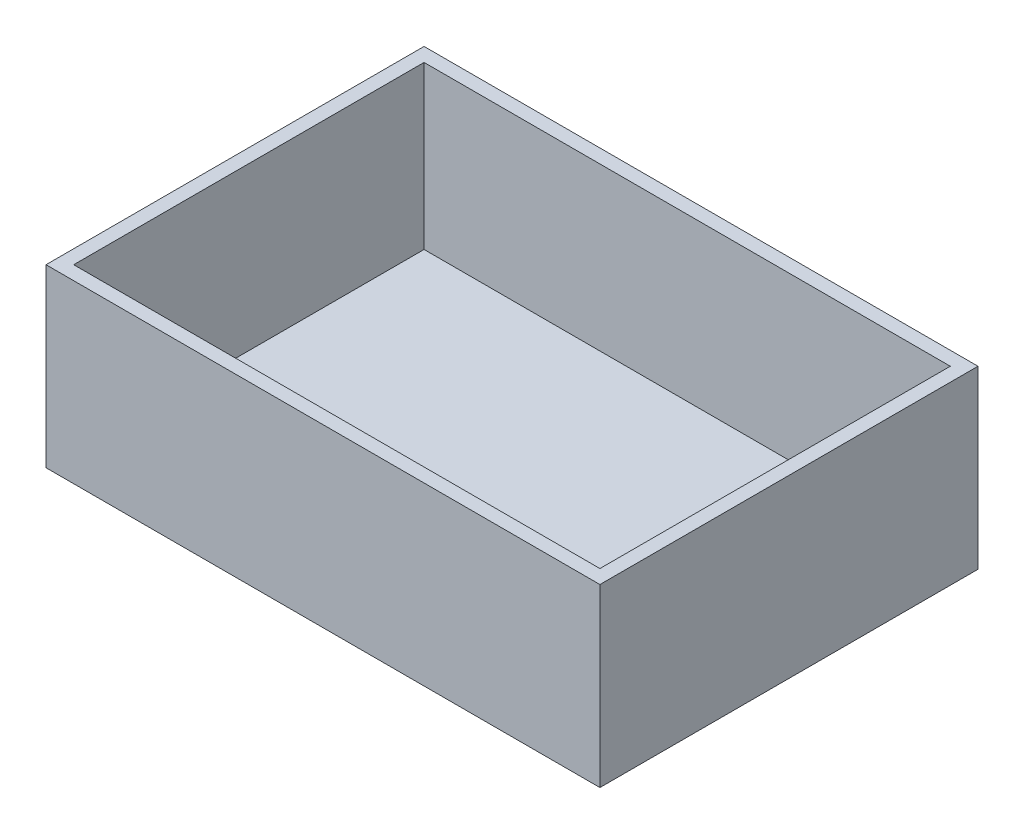
ISO-10303-21;
HEADER;
FILE_DESCRIPTION(('STEP AP214'),'2;1');
FILE_NAME('part.step','',(''),(''),'','','');
FILE_SCHEMA(('AUTOMOTIVE_DESIGN { 1 0 10303 214 1 1 1 1 }'));
ENDSEC;
DATA;
#1=APPLICATION_CONTEXT('core data for automotive mechanical design processes');
#2=APPLICATION_PROTOCOL_DEFINITION('international standard','automotive_design',2000,#1);
#3=PRODUCT_CONTEXT('',#1,'mechanical');
#4=PRODUCT('Part','Part','',(#3));
#5=PRODUCT_RELATED_PRODUCT_CATEGORY('part','',(#4));
#6=PRODUCT_DEFINITION_FORMATION('','',#4);
#7=PRODUCT_DEFINITION_CONTEXT('part definition',#1,'design');
#8=PRODUCT_DEFINITION('design','',#6,#7);
#9=PRODUCT_DEFINITION_SHAPE('','',#8);
#10=(LENGTH_UNIT() NAMED_UNIT(*) SI_UNIT(.MILLI.,.METRE.));
#11=(NAMED_UNIT(*) PLANE_ANGLE_UNIT() SI_UNIT($,.RADIAN.));
#12=(NAMED_UNIT(*) SI_UNIT($,.STERADIAN.) SOLID_ANGLE_UNIT());
#13=UNCERTAINTY_MEASURE_WITH_UNIT(LENGTH_MEASURE(1.E-05),#10,'distance_accuracy_value','');
#14=(GEOMETRIC_REPRESENTATION_CONTEXT(3) GLOBAL_UNCERTAINTY_ASSIGNED_CONTEXT((#13)) GLOBAL_UNIT_ASSIGNED_CONTEXT((#10,
#11,#12)) REPRESENTATION_CONTEXT('',''));
#15=CARTESIAN_POINT('',(0.,0.,0.));
#16=DIRECTION('',(0.,0.,1.));
#17=DIRECTION('',(1.,0.,0.));
#18=AXIS2_PLACEMENT_3D('',#15,#16,#17);
#19=CARTESIAN_POINT('',(0.,16.,0.));
#20=DIRECTION('',(1.,0.,0.));
#21=DIRECTION('',(0.,0.,-1.));
#22=AXIS2_PLACEMENT_3D('',#19,#20,#21);
#23=PLANE('',#22);
#24=DIRECTION('',(0.,0.,1.));
#25=VECTOR('',#24,1.);
#26=CARTESIAN_POINT('',(0.,0.,0.));
#27=LINE('',#26,#25);
#28=CARTESIAN_POINT('',(0.,0.,0.));
#29=VERTEX_POINT('',#28);
#30=CARTESIAN_POINT('',(0.,0.,34.4));
#31=VERTEX_POINT('',#30);
#32=EDGE_CURVE('E147',#29,#31,#27,.T.);
#33=ORIENTED_EDGE('',*,*,#32,.T.);
#34=DIRECTION('',(0.,-1.,0.));
#35=VECTOR('',#34,1.);
#36=CARTESIAN_POINT('',(0.,16.,34.4));
#37=LINE('',#36,#35);
#38=CARTESIAN_POINT('',(0.,16.,34.4));
#39=VERTEX_POINT('',#38);
#40=EDGE_CURVE('E11',#39,#31,#37,.T.);
#41=ORIENTED_EDGE('',*,*,#40,.F.);
#42=DIRECTION('',(0.,0.,1.));
#43=VECTOR('',#42,1.);
#44=CARTESIAN_POINT('',(0.,16.,0.));
#45=LINE('',#44,#43);
#46=CARTESIAN_POINT('',(0.,16.,0.));
#47=VERTEX_POINT('',#46);
#48=EDGE_CURVE('E140',#47,#39,#45,.T.);
#49=ORIENTED_EDGE('',*,*,#48,.F.);
#50=DIRECTION('',(0.,-1.,0.));
#51=VECTOR('',#50,1.);
#52=CARTESIAN_POINT('',(0.,16.,0.));
#53=LINE('',#52,#51);
#54=EDGE_CURVE('E146',#47,#29,#53,.T.);
#55=ORIENTED_EDGE('',*,*,#54,.T.);
#56=EDGE_LOOP('',(#33,#41,#49,#55));
#57=FACE_BOUND('',#56,.T.);
#58=ADVANCED_FACE('F33',(#57),#23,.F.);
#59=CARTESIAN_POINT('',(0.,16.,34.4));
#60=DIRECTION('',(0.,0.,-1.));
#61=DIRECTION('',(-1.,0.,0.));
#62=AXIS2_PLACEMENT_3D('',#59,#60,#61);
#63=PLANE('',#62);
#64=DIRECTION('',(1.,0.,0.));
#65=VECTOR('',#64,1.);
#66=CARTESIAN_POINT('',(0.,0.,34.4));
#67=LINE('',#66,#65);
#68=CARTESIAN_POINT('',(50.4,0.,34.4));
#69=VERTEX_POINT('',#68);
#70=EDGE_CURVE('E150',#31,#69,#67,.T.);
#71=ORIENTED_EDGE('',*,*,#70,.T.);
#72=DIRECTION('',(0.,-1.,0.));
#73=VECTOR('',#72,1.);
#74=CARTESIAN_POINT('',(50.4,16.,34.4));
#75=LINE('',#74,#73);
#76=CARTESIAN_POINT('',(50.4,16.,34.4));
#77=VERTEX_POINT('',#76);
#78=EDGE_CURVE('E40',#77,#69,#75,.T.);
#79=ORIENTED_EDGE('',*,*,#78,.F.);
#80=DIRECTION('',(1.,0.,0.));
#81=VECTOR('',#80,1.);
#82=CARTESIAN_POINT('',(0.,16.,34.4));
#83=LINE('',#82,#81);
#84=EDGE_CURVE('E84',#39,#77,#83,.T.);
#85=ORIENTED_EDGE('',*,*,#84,.F.);
#86=ORIENTED_EDGE('',*,*,#40,.T.);
#87=EDGE_LOOP('',(#71,#79,#85,#86));
#88=FACE_BOUND('',#87,.T.);
#89=ADVANCED_FACE('F179',(#88),#63,.F.);
#90=CARTESIAN_POINT('',(50.4,16.,0.));
#91=DIRECTION('',(-1.,0.,0.));
#92=DIRECTION('',(0.,0.,1.));
#93=AXIS2_PLACEMENT_3D('',#90,#91,#92);
#94=PLANE('',#93);
#95=DIRECTION('',(0.,0.,-1.));
#96=VECTOR('',#95,1.);
#97=CARTESIAN_POINT('',(50.4,0.,0.));
#98=LINE('',#97,#96);
#99=CARTESIAN_POINT('',(50.4,0.,0.));
#100=VERTEX_POINT('',#99);
#101=EDGE_CURVE('E152',#69,#100,#98,.T.);
#102=ORIENTED_EDGE('',*,*,#101,.T.);
#103=DIRECTION('',(0.,-1.,0.));
#104=VECTOR('',#103,1.);
#105=CARTESIAN_POINT('',(50.4,16.,0.));
#106=LINE('',#105,#104);
#107=CARTESIAN_POINT('',(50.4,16.,0.));
#108=VERTEX_POINT('',#107);
#109=EDGE_CURVE('E156',#108,#100,#106,.T.);
#110=ORIENTED_EDGE('',*,*,#109,.F.);
#111=DIRECTION('',(0.,0.,-1.));
#112=VECTOR('',#111,1.);
#113=CARTESIAN_POINT('',(50.4,16.,0.));
#114=LINE('',#113,#112);
#115=EDGE_CURVE('E143',#77,#108,#114,.T.);
#116=ORIENTED_EDGE('',*,*,#115,.F.);
#117=ORIENTED_EDGE('',*,*,#78,.T.);
#118=EDGE_LOOP('',(#102,#110,#116,#117));
#119=FACE_BOUND('',#118,.T.);
#120=ADVANCED_FACE('F161',(#119),#94,.F.);
#121=CARTESIAN_POINT('',(0.,16.,0.));
#122=DIRECTION('',(0.,0.,1.));
#123=DIRECTION('',(1.,0.,0.));
#124=AXIS2_PLACEMENT_3D('',#121,#122,#123);
#125=PLANE('',#124);
#126=DIRECTION('',(-1.,0.,0.));
#127=VECTOR('',#126,1.);
#128=CARTESIAN_POINT('',(0.,0.,0.));
#129=LINE('',#128,#127);
#130=EDGE_CURVE('E77',#100,#29,#129,.T.);
#131=ORIENTED_EDGE('',*,*,#130,.T.);
#132=ORIENTED_EDGE('',*,*,#54,.F.);
#133=DIRECTION('',(-1.,0.,0.));
#134=VECTOR('',#133,1.);
#135=CARTESIAN_POINT('',(0.,16.,0.));
#136=LINE('',#135,#134);
#137=EDGE_CURVE('E56',#108,#47,#136,.T.);
#138=ORIENTED_EDGE('',*,*,#137,.F.);
#139=ORIENTED_EDGE('',*,*,#109,.T.);
#140=EDGE_LOOP('',(#131,#132,#138,#139));
#141=FACE_BOUND('',#140,.T.);
#142=ADVANCED_FACE('F169',(#141),#125,.F.);
#143=CARTESIAN_POINT('',(0.,16.,0.));
#144=DIRECTION('',(0.,1.,0.));
#145=DIRECTION('',(0.,0.,1.));
#146=AXIS2_PLACEMENT_3D('',#143,#144,#145);
#147=PLANE('',#146);
#148=DIRECTION('',(0.,0.,1.));
#149=VECTOR('',#148,1.);
#150=CARTESIAN_POINT('',(1.26,16.,0.));
#151=LINE('',#150,#149);
#152=CARTESIAN_POINT('',(1.26,16.,1.26));
#153=VERTEX_POINT('',#152);
#154=CARTESIAN_POINT('',(1.26,16.,33.14));
#155=VERTEX_POINT('',#154);
#156=EDGE_CURVE('E129',#153,#155,#151,.T.);
#157=ORIENTED_EDGE('',*,*,#156,.F.);
#158=DIRECTION('',(-1.,0.,0.));
#159=VECTOR('',#158,1.);
#160=CARTESIAN_POINT('',(0.,16.,1.26));
#161=LINE('',#160,#159);
#162=CARTESIAN_POINT('',(49.14,16.,1.26));
#163=VERTEX_POINT('',#162);
#164=EDGE_CURVE('E138',#163,#153,#161,.T.);
#165=ORIENTED_EDGE('',*,*,#164,.F.);
#166=DIRECTION('',(0.,0.,-1.));
#167=VECTOR('',#166,1.);
#168=CARTESIAN_POINT('',(49.14,16.,0.));
#169=LINE('',#168,#167);
#170=CARTESIAN_POINT('',(49.14,16.,33.14));
#171=VERTEX_POINT('',#170);
#172=EDGE_CURVE('E136',#171,#163,#169,.T.);
#173=ORIENTED_EDGE('',*,*,#172,.F.);
#174=DIRECTION('',(1.,0.,0.));
#175=VECTOR('',#174,1.);
#176=CARTESIAN_POINT('',(0.,16.,33.14));
#177=LINE('',#176,#175);
#178=EDGE_CURVE('E121',#155,#171,#177,.T.);
#179=ORIENTED_EDGE('',*,*,#178,.F.);
#180=EDGE_LOOP('',(#157,#165,#173,#179));
#181=FACE_BOUND('',#180,.T.);
#182=ORIENTED_EDGE('',*,*,#48,.T.);
#183=ORIENTED_EDGE('',*,*,#84,.T.);
#184=ORIENTED_EDGE('',*,*,#115,.T.);
#185=ORIENTED_EDGE('',*,*,#137,.T.);
#186=EDGE_LOOP('',(#182,#183,#184,#185));
#187=FACE_BOUND('',#186,.T.);
#188=ADVANCED_FACE('F171',(#181,#187),#147,.T.);
#189=CARTESIAN_POINT('',(0.,0.,0.));
#190=DIRECTION('',(0.,1.,0.));
#191=DIRECTION('',(0.,0.,1.));
#192=AXIS2_PLACEMENT_3D('',#189,#190,#191);
#193=PLANE('',#192);
#194=ORIENTED_EDGE('',*,*,#32,.F.);
#195=ORIENTED_EDGE('',*,*,#130,.F.);
#196=ORIENTED_EDGE('',*,*,#101,.F.);
#197=ORIENTED_EDGE('',*,*,#70,.F.);
#198=EDGE_LOOP('',(#194,#195,#196,#197));
#199=FACE_BOUND('',#198,.T.);
#200=ADVANCED_FACE('F165',(#199),#193,.F.);
#201=CARTESIAN_POINT('',(1.26,16.,0.));
#202=DIRECTION('',(1.,0.,0.));
#203=DIRECTION('',(0.,0.,-1.));
#204=AXIS2_PLACEMENT_3D('',#201,#202,#203);
#205=PLANE('',#204);
#206=DIRECTION('',(0.,0.,1.));
#207=VECTOR('',#206,1.);
#208=CARTESIAN_POINT('',(1.26,1.26,0.));
#209=LINE('',#208,#207);
#210=CARTESIAN_POINT('',(1.26,1.26,1.26));
#211=VERTEX_POINT('',#210);
#212=CARTESIAN_POINT('',(1.26,1.26,33.14));
#213=VERTEX_POINT('',#212);
#214=EDGE_CURVE('E112',#211,#213,#209,.T.);
#215=ORIENTED_EDGE('',*,*,#214,.F.);
#216=DIRECTION('',(0.,-1.,0.));
#217=VECTOR('',#216,1.);
#218=CARTESIAN_POINT('',(1.26,16.,1.26));
#219=LINE('',#218,#217);
#220=EDGE_CURVE('E132',#153,#211,#219,.T.);
#221=ORIENTED_EDGE('',*,*,#220,.F.);
#222=ORIENTED_EDGE('',*,*,#156,.T.);
#223=DIRECTION('',(0.,-1.,0.));
#224=VECTOR('',#223,1.);
#225=CARTESIAN_POINT('',(1.26,16.,33.14));
#226=LINE('',#225,#224);
#227=EDGE_CURVE('E124',#155,#213,#226,.T.);
#228=ORIENTED_EDGE('',*,*,#227,.T.);
#229=EDGE_LOOP('',(#215,#221,#222,#228));
#230=FACE_BOUND('',#229,.T.);
#231=ADVANCED_FACE('F206',(#230),#205,.T.);
#232=CARTESIAN_POINT('',(0.,16.,33.14));
#233=DIRECTION('',(0.,0.,-1.));
#234=DIRECTION('',(-1.,0.,0.));
#235=AXIS2_PLACEMENT_3D('',#232,#233,#234);
#236=PLANE('',#235);
#237=DIRECTION('',(1.,0.,0.));
#238=VECTOR('',#237,1.);
#239=CARTESIAN_POINT('',(0.,1.26,33.14));
#240=LINE('',#239,#238);
#241=CARTESIAN_POINT('',(49.14,1.26,33.14));
#242=VERTEX_POINT('',#241);
#243=EDGE_CURVE('E106',#213,#242,#240,.T.);
#244=ORIENTED_EDGE('',*,*,#243,.F.);
#245=ORIENTED_EDGE('',*,*,#227,.F.);
#246=ORIENTED_EDGE('',*,*,#178,.T.);
#247=DIRECTION('',(0.,-1.,0.));
#248=VECTOR('',#247,1.);
#249=CARTESIAN_POINT('',(49.14,16.,33.14));
#250=LINE('',#249,#248);
#251=EDGE_CURVE('E118',#171,#242,#250,.T.);
#252=ORIENTED_EDGE('',*,*,#251,.T.);
#253=EDGE_LOOP('',(#244,#245,#246,#252));
#254=FACE_BOUND('',#253,.T.);
#255=ADVANCED_FACE('F119',(#254),#236,.T.);
#256=CARTESIAN_POINT('',(49.14,16.,0.));
#257=DIRECTION('',(-1.,0.,0.));
#258=DIRECTION('',(0.,0.,1.));
#259=AXIS2_PLACEMENT_3D('',#256,#257,#258);
#260=PLANE('',#259);
#261=DIRECTION('',(0.,0.,-1.));
#262=VECTOR('',#261,1.);
#263=CARTESIAN_POINT('',(49.14,1.26,0.));
#264=LINE('',#263,#262);
#265=CARTESIAN_POINT('',(49.14,1.26,1.26));
#266=VERTEX_POINT('',#265);
#267=EDGE_CURVE('E110',#242,#266,#264,.T.);
#268=ORIENTED_EDGE('',*,*,#267,.F.);
#269=ORIENTED_EDGE('',*,*,#251,.F.);
#270=ORIENTED_EDGE('',*,*,#172,.T.);
#271=DIRECTION('',(0.,-1.,0.));
#272=VECTOR('',#271,1.);
#273=CARTESIAN_POINT('',(49.14,16.,1.26));
#274=LINE('',#273,#272);
#275=EDGE_CURVE('E47',#163,#266,#274,.T.);
#276=ORIENTED_EDGE('',*,*,#275,.T.);
#277=EDGE_LOOP('',(#268,#269,#270,#276));
#278=FACE_BOUND('',#277,.T.);
#279=ADVANCED_FACE('F126',(#278),#260,.T.);
#280=CARTESIAN_POINT('',(0.,16.,1.26));
#281=DIRECTION('',(0.,0.,1.));
#282=DIRECTION('',(1.,0.,0.));
#283=AXIS2_PLACEMENT_3D('',#280,#281,#282);
#284=PLANE('',#283);
#285=DIRECTION('',(-1.,0.,0.));
#286=VECTOR('',#285,1.);
#287=CARTESIAN_POINT('',(0.,1.26,1.26));
#288=LINE('',#287,#286);
#289=EDGE_CURVE('E127',#266,#211,#288,.T.);
#290=ORIENTED_EDGE('',*,*,#289,.F.);
#291=ORIENTED_EDGE('',*,*,#275,.F.);
#292=ORIENTED_EDGE('',*,*,#164,.T.);
#293=ORIENTED_EDGE('',*,*,#220,.T.);
#294=EDGE_LOOP('',(#290,#291,#292,#293));
#295=FACE_BOUND('',#294,.T.);
#296=ADVANCED_FACE('F236',(#295),#284,.T.);
#297=CARTESIAN_POINT('',(0.,1.26,0.));
#298=DIRECTION('',(0.,1.,0.));
#299=DIRECTION('',(0.,0.,1.));
#300=AXIS2_PLACEMENT_3D('',#297,#298,#299);
#301=PLANE('',#300);
#302=ORIENTED_EDGE('',*,*,#214,.T.);
#303=ORIENTED_EDGE('',*,*,#243,.T.);
#304=ORIENTED_EDGE('',*,*,#267,.T.);
#305=ORIENTED_EDGE('',*,*,#289,.T.);
#306=EDGE_LOOP('',(#302,#303,#304,#305));
#307=FACE_BOUND('',#306,.T.);
#308=ADVANCED_FACE('F108',(#307),#301,.T.);
#309=CLOSED_SHELL('',(#58,#89,#120,#142,#188,#200,#231,#255,#279,#296,#308));
#310=MANIFOLD_SOLID_BREP('B2',#309);
#311=ADVANCED_BREP_SHAPE_REPRESENTATION('',(#18,#310),#14);
#312=SHAPE_DEFINITION_REPRESENTATION(#9,#311);
ENDSEC;
END-ISO-10303-21;
